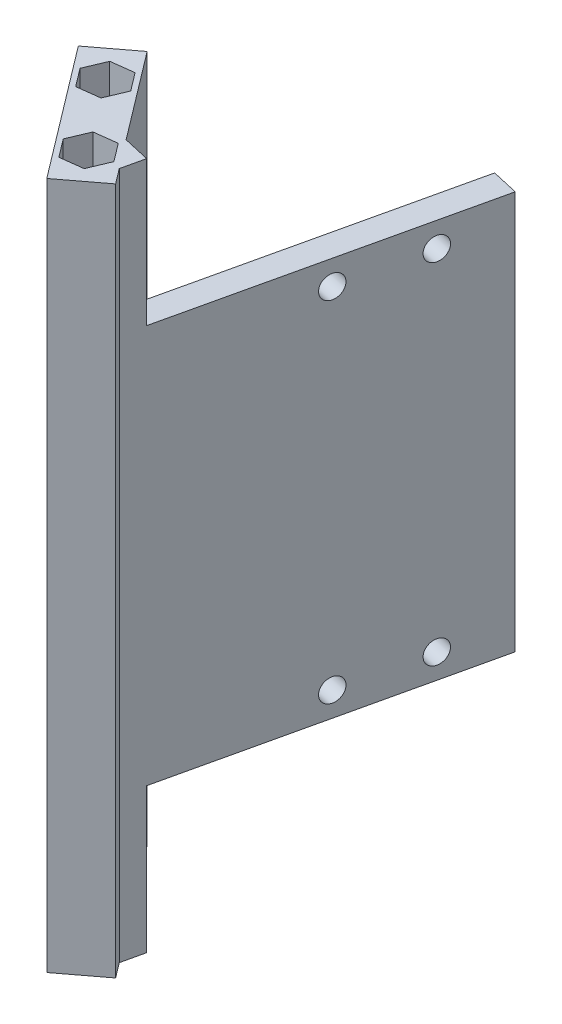
ISO-10303-21;
HEADER;
FILE_DESCRIPTION(('STEP AP214'),'2;1');
FILE_NAME('part.step','',(''),(''),'','','');
FILE_SCHEMA(('AUTOMOTIVE_DESIGN { 1 0 10303 214 1 1 1 1 }'));
ENDSEC;
DATA;
#1=APPLICATION_CONTEXT('core data for automotive mechanical design processes');
#2=APPLICATION_PROTOCOL_DEFINITION('international standard','automotive_design',2000,#1);
#3=PRODUCT_CONTEXT('',#1,'mechanical');
#4=PRODUCT('Part','Part','',(#3));
#5=PRODUCT_RELATED_PRODUCT_CATEGORY('part','',(#4));
#6=PRODUCT_DEFINITION_FORMATION('','',#4);
#7=PRODUCT_DEFINITION_CONTEXT('part definition',#1,'design');
#8=PRODUCT_DEFINITION('design','',#6,#7);
#9=PRODUCT_DEFINITION_SHAPE('','',#8);
#10=(LENGTH_UNIT() NAMED_UNIT(*) SI_UNIT(.MILLI.,.METRE.));
#11=(NAMED_UNIT(*) PLANE_ANGLE_UNIT() SI_UNIT($,.RADIAN.));
#12=(NAMED_UNIT(*) SI_UNIT($,.STERADIAN.) SOLID_ANGLE_UNIT());
#13=UNCERTAINTY_MEASURE_WITH_UNIT(LENGTH_MEASURE(1.E-05),#10,'distance_accuracy_value','');
#14=(GEOMETRIC_REPRESENTATION_CONTEXT(3) GLOBAL_UNCERTAINTY_ASSIGNED_CONTEXT((#13)) GLOBAL_UNIT_ASSIGNED_CONTEXT((#10,
#11,#12)) REPRESENTATION_CONTEXT('',''));
#15=CARTESIAN_POINT('',(0.,0.,0.));
#16=DIRECTION('',(0.,0.,1.));
#17=DIRECTION('',(1.,0.,0.));
#18=AXIS2_PLACEMENT_3D('',#15,#16,#17);
#19=CARTESIAN_POINT('',(67.5223445009082,126.,-128.357760025199));
#20=DIRECTION('',(-0.796824870464185,0.,0.604210332425501));
#21=DIRECTION('',(0.604210332425501,0.,0.796824870464185));
#22=AXIS2_PLACEMENT_3D('',#19,#20,#21);
#23=PLANE('',#22);
#24=DIRECTION('',(-0.604210332425502,0.,-0.796824870464185));
#25=VECTOR('',#24,1.);
#26=CARTESIAN_POINT('',(67.5223445009082,0.,-128.357760025199));
#27=LINE('',#26,#25);
#28=CARTESIAN_POINT('',(67.5223445009082,0.,-128.357760025199));
#29=VERTEX_POINT('',#28);
#30=CARTESIAN_POINT('',(65.4239440378438,0.,-131.125103758715));
#31=VERTEX_POINT('',#30);
#32=EDGE_CURVE('E336',#29,#31,#27,.T.);
#33=ORIENTED_EDGE('',*,*,#32,.T.);
#34=DIRECTION('',(0.,-1.,0.));
#35=VECTOR('',#34,1.);
#36=CARTESIAN_POINT('',(65.4239440378438,126.,-131.125103758715));
#37=LINE('',#36,#35);
#38=CARTESIAN_POINT('',(65.4239440378438,126.,-131.125103758715));
#39=VERTEX_POINT('',#38);
#40=EDGE_CURVE('E253',#39,#31,#37,.T.);
#41=ORIENTED_EDGE('',*,*,#40,.F.);
#42=DIRECTION('',(-0.604210332425502,0.,-0.796824870464185));
#43=VECTOR('',#42,1.);
#44=CARTESIAN_POINT('',(67.5223445009082,126.,-128.357760025199));
#45=LINE('',#44,#43);
#46=CARTESIAN_POINT('',(67.5223445009082,126.,-128.357760025199));
#47=VERTEX_POINT('',#46);
#48=EDGE_CURVE('E326',#47,#39,#45,.T.);
#49=ORIENTED_EDGE('',*,*,#48,.F.);
#50=DIRECTION('',(0.,-1.,0.));
#51=VECTOR('',#50,1.);
#52=CARTESIAN_POINT('',(67.5223445009082,126.,-128.357760025199));
#53=LINE('',#52,#51);
#54=EDGE_CURVE('E335',#47,#29,#53,.T.);
#55=ORIENTED_EDGE('',*,*,#54,.T.);
#56=EDGE_LOOP('',(#33,#41,#49,#55));
#57=FACE_BOUND('',#56,.T.);
#58=ADVANCED_FACE('F43',(#57),#23,.F.);
#59=CARTESIAN_POINT('',(0.,126.,0.));
#60=DIRECTION('',(0.,1.,0.));
#61=DIRECTION('',(0.,0.,1.));
#62=AXIS2_PLACEMENT_3D('',#59,#60,#61);
#63=PLANE('',#62);
#64=DIRECTION('',(-0.97504112145409,0.,-0.222024348830373));
#65=VECTOR('',#64,1.);
#66=CARTESIAN_POINT('',(71.2306523911913,126.,-134.105765241538));
#67=LINE('',#66,#65);
#68=CARTESIAN_POINT('',(66.3554467839236,126.,-135.215886985689));
#69=VERTEX_POINT('',#68);
#70=CARTESIAN_POINT('',(61.4802411766504,126.,-136.326008729842));
#71=VERTEX_POINT('',#70);
#72=EDGE_CURVE('E207',#69,#71,#67,.T.);
#73=ORIENTED_EDGE('',*,*,#72,.T.);
#74=CARTESIAN_POINT('',(49.3960345281431,126.,-152.262506139125));
#75=VERTEX_POINT('',#74);
#76=EDGE_CURVE('E228',#71,#75,#45,.T.);
#77=ORIENTED_EDGE('',*,*,#76,.T.);
#78=DIRECTION('',(-0.796824870464183,0.,0.604210332425504));
#79=VECTOR('',#78,1.);
#80=CARTESIAN_POINT('',(49.3960345281431,126.,-152.262506139125));
#81=LINE('',#80,#79);
#82=CARTESIAN_POINT('',(42.2246106939655,126.,-146.824613147295));
#83=VERTEX_POINT('',#82);
#84=EDGE_CURVE('E329',#75,#83,#81,.T.);
#85=ORIENTED_EDGE('',*,*,#84,.T.);
#86=DIRECTION('',(0.604210332425502,0.,0.796824870464184));
#87=VECTOR('',#86,1.);
#88=CARTESIAN_POINT('',(42.2246106939655,126.,-146.824613147295));
#89=LINE('',#88,#87);
#90=CARTESIAN_POINT('',(60.3509206667306,126.,-122.91986703337));
#91=VERTEX_POINT('',#90);
#92=EDGE_CURVE('E331',#83,#91,#89,.T.);
#93=ORIENTED_EDGE('',*,*,#92,.T.);
#94=DIRECTION('',(0.796824870464176,0.,-0.604210332425513));
#95=VECTOR('',#94,1.);
#96=CARTESIAN_POINT('',(60.3509206667306,126.,-122.91986703337));
#97=LINE('',#96,#95);
#98=EDGE_CURVE('E333',#91,#47,#97,.T.);
#99=ORIENTED_EDGE('',*,*,#98,.T.);
#100=ORIENTED_EDGE('',*,*,#48,.T.);
#101=DIRECTION('',(-0.222024348830392,0.,0.975041121454085));
#102=VECTOR('',#101,1.);
#103=CARTESIAN_POINT('',(78.8793690236961,126.,-190.215886985689));
#104=LINE('',#103,#102);
#105=EDGE_CURVE('E66',#69,#39,#104,.T.);
#106=ORIENTED_EDGE('',*,*,#105,.F.);
#107=EDGE_LOOP('',(#73,#77,#85,#93,#99,#100,#106));
#108=FACE_BOUND('',#107,.T.);
#109=DIRECTION('',(-0.992175746401979,0.,0.124849061877433));
#110=VECTOR('',#109,1.);
#111=CARTESIAN_POINT('',(51.6525368786409,126.,-147.797112139147));
#112=LINE('',#111,#110);
#113=CARTESIAN_POINT('',(51.6525368786409,126.,-147.797112139147));
#114=VERTEX_POINT('',#113);
#115=CARTESIAN_POINT('',(47.5281397519071,126.,-147.278124334869));
#116=VERTEX_POINT('',#115);
#117=EDGE_CURVE('E283',#114,#116,#112,.T.);
#118=ORIENTED_EDGE('',*,*,#117,.F.);
#119=DIRECTION('',(-0.604210332425503,0.,-0.796824870464183));
#120=VECTOR('',#119,1.);
#121=CARTESIAN_POINT('',(54.1641920647666,126.,-144.484773354238));
#122=LINE('',#121,#120);
#123=CARTESIAN_POINT('',(54.1641920647666,126.,-144.484773354238));
#124=VERTEX_POINT('',#123);
#125=EDGE_CURVE('E281',#124,#114,#122,.T.);
#126=ORIENTED_EDGE('',*,*,#125,.F.);
#127=DIRECTION('',(0.387965413976477,0.,-0.921673932341618));
#128=VECTOR('',#127,1.);
#129=CARTESIAN_POINT('',(52.5514501241585,126.,-140.653446765052));
#130=LINE('',#129,#128);
#131=CARTESIAN_POINT('',(52.5514501241585,126.,-140.653446765052));
#132=VERTEX_POINT('',#131);
#133=EDGE_CURVE('E293',#132,#124,#130,.T.);
#134=ORIENTED_EDGE('',*,*,#133,.F.);
#135=DIRECTION('',(0.992175746401977,0.,-0.124849061877452));
#136=VECTOR('',#135,1.);
#137=CARTESIAN_POINT('',(48.4270529974246,126.,-140.134458960775));
#138=LINE('',#137,#136);
#139=CARTESIAN_POINT('',(48.4270529974246,126.,-140.134458960775));
#140=VERTEX_POINT('',#139);
#141=EDGE_CURVE('E290',#140,#132,#138,.T.);
#142=ORIENTED_EDGE('',*,*,#141,.F.);
#143=DIRECTION('',(0.6042103324255,0.,0.796824870464186));
#144=VECTOR('',#143,1.);
#145=CARTESIAN_POINT('',(45.9153978112989,126.,-143.446797745683));
#146=LINE('',#145,#144);
#147=CARTESIAN_POINT('',(45.9153978112989,126.,-143.446797745683));
#148=VERTEX_POINT('',#147);
#149=EDGE_CURVE('E288',#148,#140,#146,.T.);
#150=ORIENTED_EDGE('',*,*,#149,.F.);
#151=DIRECTION('',(-0.387965413976479,0.,0.921673932341617));
#152=VECTOR('',#151,1.);
#153=CARTESIAN_POINT('',(47.5281397519071,126.,-147.278124334869));
#154=LINE('',#153,#152);
#155=EDGE_CURVE('E286',#116,#148,#154,.T.);
#156=ORIENTED_EDGE('',*,*,#155,.F.);
#157=EDGE_LOOP('',(#118,#126,#134,#142,#150,#156));
#158=FACE_BOUND('',#157,.T.);
#159=DIRECTION('',(-0.992175746401984,0.,0.124849061877393));
#160=VECTOR('',#159,1.);
#161=CARTESIAN_POINT('',(61.3199021974491,126.,-135.04791421172));
#162=LINE('',#161,#160);
#163=CARTESIAN_POINT('',(61.3199021974491,126.,-135.04791421172));
#164=VERTEX_POINT('',#163);
#165=CARTESIAN_POINT('',(57.1955050707153,126.,-134.528926407442));
#166=VERTEX_POINT('',#165);
#167=EDGE_CURVE('E236',#164,#166,#162,.T.);
#168=ORIENTED_EDGE('',*,*,#167,.F.);
#169=DIRECTION('',(-0.604210332425468,0.,-0.79682487046421));
#170=VECTOR('',#169,1.);
#171=CARTESIAN_POINT('',(63.8315573835746,126.,-131.735575426811));
#172=LINE('',#171,#170);
#173=CARTESIAN_POINT('',(63.8315573835746,126.,-131.735575426811));
#174=VERTEX_POINT('',#173);
#175=EDGE_CURVE('E234',#174,#164,#172,.T.);
#176=ORIENTED_EDGE('',*,*,#175,.F.);
#177=DIRECTION('',(0.387965413976512,0.,-0.921673932341603));
#178=VECTOR('',#177,1.);
#179=CARTESIAN_POINT('',(62.2188154429663,126.,-127.904248837625));
#180=LINE('',#179,#178);
#181=CARTESIAN_POINT('',(62.2188154429663,126.,-127.904248837625));
#182=VERTEX_POINT('',#181);
#183=EDGE_CURVE('E246',#182,#174,#180,.T.);
#184=ORIENTED_EDGE('',*,*,#183,.F.);
#185=DIRECTION('',(0.992175746401984,0.,-0.124849061877394));
#186=VECTOR('',#185,1.);
#187=CARTESIAN_POINT('',(58.0944183162325,126.,-127.385261033348));
#188=LINE('',#187,#186);
#189=CARTESIAN_POINT('',(58.0944183162325,126.,-127.385261033348));
#190=VERTEX_POINT('',#189);
#191=EDGE_CURVE('E243',#190,#182,#188,.T.);
#192=ORIENTED_EDGE('',*,*,#191,.F.);
#193=DIRECTION('',(0.60421033242547,0.,0.796824870464208));
#194=VECTOR('',#193,1.);
#195=CARTESIAN_POINT('',(55.582763130107,126.,-130.697599818256));
#196=LINE('',#195,#194);
#197=CARTESIAN_POINT('',(55.582763130107,126.,-130.697599818256));
#198=VERTEX_POINT('',#197);
#199=EDGE_CURVE('E241',#198,#190,#196,.T.);
#200=ORIENTED_EDGE('',*,*,#199,.F.);
#201=DIRECTION('',(-0.387965413976513,0.,0.921673932341603));
#202=VECTOR('',#201,1.);
#203=CARTESIAN_POINT('',(57.1955050707153,126.,-134.528926407442));
#204=LINE('',#203,#202);
#205=EDGE_CURVE('E239',#166,#198,#204,.T.);
#206=ORIENTED_EDGE('',*,*,#205,.F.);
#207=EDGE_LOOP('',(#168,#176,#184,#192,#200,#206));
#208=FACE_BOUND('',#207,.T.);
#209=ADVANCED_FACE('F372',(#108,#158,#208),#63,.T.);
#210=CARTESIAN_POINT('',(0.,0.,0.));
#211=DIRECTION('',(0.,1.,0.));
#212=DIRECTION('',(0.,0.,1.));
#213=AXIS2_PLACEMENT_3D('',#210,#211,#212);
#214=PLANE('',#213);
#215=DIRECTION('',(-0.604210332425503,0.,-0.796824870464183));
#216=VECTOR('',#215,1.);
#217=CARTESIAN_POINT('',(54.1641920647666,0.,-144.484773354238));
#218=LINE('',#217,#216);
#219=CARTESIAN_POINT('',(54.1641920647666,0.,-144.484773354238));
#220=VERTEX_POINT('',#219);
#221=CARTESIAN_POINT('',(51.6525368786409,0.,-147.797112139147));
#222=VERTEX_POINT('',#221);
#223=EDGE_CURVE('E280',#220,#222,#218,.T.);
#224=ORIENTED_EDGE('',*,*,#223,.T.);
#225=DIRECTION('',(-0.992175746401979,0.,0.124849061877433));
#226=VECTOR('',#225,1.);
#227=CARTESIAN_POINT('',(51.6525368786409,0.,-147.797112139147));
#228=LINE('',#227,#226);
#229=CARTESIAN_POINT('',(47.5281397519071,0.,-147.278124334869));
#230=VERTEX_POINT('',#229);
#231=EDGE_CURVE('E298',#222,#230,#228,.T.);
#232=ORIENTED_EDGE('',*,*,#231,.T.);
#233=DIRECTION('',(-0.387965413976479,0.,0.921673932341617));
#234=VECTOR('',#233,1.);
#235=CARTESIAN_POINT('',(47.5281397519071,0.,-147.278124334869));
#236=LINE('',#235,#234);
#237=CARTESIAN_POINT('',(45.9153978112989,0.,-143.446797745683));
#238=VERTEX_POINT('',#237);
#239=EDGE_CURVE('E301',#230,#238,#236,.T.);
#240=ORIENTED_EDGE('',*,*,#239,.T.);
#241=DIRECTION('',(0.6042103324255,0.,0.796824870464186));
#242=VECTOR('',#241,1.);
#243=CARTESIAN_POINT('',(45.9153978112989,0.,-143.446797745683));
#244=LINE('',#243,#242);
#245=CARTESIAN_POINT('',(48.4270529974246,0.,-140.134458960775));
#246=VERTEX_POINT('',#245);
#247=EDGE_CURVE('E304',#238,#246,#244,.T.);
#248=ORIENTED_EDGE('',*,*,#247,.T.);
#249=DIRECTION('',(0.992175746401977,0.,-0.124849061877452));
#250=VECTOR('',#249,1.);
#251=CARTESIAN_POINT('',(48.4270529974246,0.,-140.134458960775));
#252=LINE('',#251,#250);
#253=CARTESIAN_POINT('',(52.5514501241585,0.,-140.653446765052));
#254=VERTEX_POINT('',#253);
#255=EDGE_CURVE('E307',#246,#254,#252,.T.);
#256=ORIENTED_EDGE('',*,*,#255,.T.);
#257=DIRECTION('',(0.387965413976477,0.,-0.921673932341618));
#258=VECTOR('',#257,1.);
#259=CARTESIAN_POINT('',(52.5514501241585,0.,-140.653446765052));
#260=LINE('',#259,#258);
#261=EDGE_CURVE('E284',#254,#220,#260,.T.);
#262=ORIENTED_EDGE('',*,*,#261,.T.);
#263=EDGE_LOOP('',(#224,#232,#240,#248,#256,#262));
#264=FACE_BOUND('',#263,.T.);
#265=CARTESIAN_POINT('',(61.4802411766532,0.,-136.326008729841));
#266=VERTEX_POINT('',#265);
#267=CARTESIAN_POINT('',(49.3960345281431,0.,-152.262506139125));
#268=VERTEX_POINT('',#267);
#269=EDGE_CURVE('E325',#266,#268,#27,.T.);
#270=ORIENTED_EDGE('',*,*,#269,.F.);
#271=DIRECTION('',(-0.97504112145409,0.,-0.222024348830373));
#272=VECTOR('',#271,1.);
#273=CARTESIAN_POINT('',(71.2306523911913,0.,-134.105765241538));
#274=LINE('',#273,#272);
#275=CARTESIAN_POINT('',(66.3554467839236,0.,-135.215886985689));
#276=VERTEX_POINT('',#275);
#277=EDGE_CURVE('E377',#276,#266,#274,.T.);
#278=ORIENTED_EDGE('',*,*,#277,.F.);
#279=DIRECTION('',(-0.222024348830392,0.,0.975041121454085));
#280=VECTOR('',#279,1.);
#281=CARTESIAN_POINT('',(78.8793690236961,0.,-190.215886985689));
#282=LINE('',#281,#280);
#283=EDGE_CURVE('E379',#276,#31,#282,.T.);
#284=ORIENTED_EDGE('',*,*,#283,.T.);
#285=ORIENTED_EDGE('',*,*,#32,.F.);
#286=DIRECTION('',(0.796824870464176,0.,-0.604210332425513));
#287=VECTOR('',#286,1.);
#288=CARTESIAN_POINT('',(60.3509206667306,0.,-122.91986703337));
#289=LINE('',#288,#287);
#290=CARTESIAN_POINT('',(60.3509206667306,0.,-122.91986703337));
#291=VERTEX_POINT('',#290);
#292=EDGE_CURVE('E343',#291,#29,#289,.T.);
#293=ORIENTED_EDGE('',*,*,#292,.F.);
#294=DIRECTION('',(0.604210332425502,0.,0.796824870464184));
#295=VECTOR('',#294,1.);
#296=CARTESIAN_POINT('',(42.2246106939655,0.,-146.824613147295));
#297=LINE('',#296,#295);
#298=CARTESIAN_POINT('',(42.2246106939655,0.,-146.824613147295));
#299=VERTEX_POINT('',#298);
#300=EDGE_CURVE('E341',#299,#291,#297,.T.);
#301=ORIENTED_EDGE('',*,*,#300,.F.);
#302=DIRECTION('',(-0.796824870464183,0.,0.604210332425504));
#303=VECTOR('',#302,1.);
#304=CARTESIAN_POINT('',(49.3960345281431,0.,-152.262506139125));
#305=LINE('',#304,#303);
#306=EDGE_CURVE('E339',#268,#299,#305,.T.);
#307=ORIENTED_EDGE('',*,*,#306,.F.);
#308=EDGE_LOOP('',(#270,#278,#284,#285,#293,#301,#307));
#309=FACE_BOUND('',#308,.T.);
#310=DIRECTION('',(-0.604210332425468,0.,-0.79682487046421));
#311=VECTOR('',#310,1.);
#312=CARTESIAN_POINT('',(63.8315573835746,0.,-131.735575426811));
#313=LINE('',#312,#311);
#314=CARTESIAN_POINT('',(63.8315573835746,0.,-131.735575426811));
#315=VERTEX_POINT('',#314);
#316=CARTESIAN_POINT('',(61.3199021974491,0.,-135.04791421172));
#317=VERTEX_POINT('',#316);
#318=EDGE_CURVE('E249',#315,#317,#313,.T.);
#319=ORIENTED_EDGE('',*,*,#318,.T.);
#320=DIRECTION('',(-0.992175746401984,0.,0.124849061877393));
#321=VECTOR('',#320,1.);
#322=CARTESIAN_POINT('',(61.3199021974491,0.,-135.04791421172));
#323=LINE('',#322,#321);
#324=CARTESIAN_POINT('',(57.1955050707153,0.,-134.528926407442));
#325=VERTEX_POINT('',#324);
#326=EDGE_CURVE('E252',#317,#325,#323,.T.);
#327=ORIENTED_EDGE('',*,*,#326,.T.);
#328=DIRECTION('',(-0.387965413976513,0.,0.921673932341603));
#329=VECTOR('',#328,1.);
#330=CARTESIAN_POINT('',(57.1955050707153,0.,-134.528926407442));
#331=LINE('',#330,#329);
#332=CARTESIAN_POINT('',(55.582763130107,0.,-130.697599818256));
#333=VERTEX_POINT('',#332);
#334=EDGE_CURVE('E256',#325,#333,#331,.T.);
#335=ORIENTED_EDGE('',*,*,#334,.T.);
#336=DIRECTION('',(0.60421033242547,0.,0.796824870464208));
#337=VECTOR('',#336,1.);
#338=CARTESIAN_POINT('',(55.582763130107,0.,-130.697599818256));
#339=LINE('',#338,#337);
#340=CARTESIAN_POINT('',(58.0944183162325,0.,-127.385261033348));
#341=VERTEX_POINT('',#340);
#342=EDGE_CURVE('E259',#333,#341,#339,.T.);
#343=ORIENTED_EDGE('',*,*,#342,.T.);
#344=DIRECTION('',(0.992175746401984,0.,-0.124849061877394));
#345=VECTOR('',#344,1.);
#346=CARTESIAN_POINT('',(58.0944183162325,0.,-127.385261033348));
#347=LINE('',#346,#345);
#348=CARTESIAN_POINT('',(62.2188154429663,0.,-127.904248837625));
#349=VERTEX_POINT('',#348);
#350=EDGE_CURVE('E262',#341,#349,#347,.T.);
#351=ORIENTED_EDGE('',*,*,#350,.T.);
#352=DIRECTION('',(0.387965413976512,0.,-0.921673932341603));
#353=VECTOR('',#352,1.);
#354=CARTESIAN_POINT('',(62.2188154429663,0.,-127.904248837625));
#355=LINE('',#354,#353);
#356=EDGE_CURVE('E237',#349,#315,#355,.T.);
#357=ORIENTED_EDGE('',*,*,#356,.T.);
#358=EDGE_LOOP('',(#319,#327,#335,#343,#351,#357));
#359=FACE_BOUND('',#358,.T.);
#360=ADVANCED_FACE('F362',(#264,#309,#359),#214,.F.);
#361=ORIENTED_EDGE('',*,*,#76,.F.);
#362=DIRECTION('',(0.,-1.,0.));
#363=VECTOR('',#362,1.);
#364=CARTESIAN_POINT('',(61.4802411766532,126.,-136.326008729841));
#365=LINE('',#364,#363);
#366=CARTESIAN_POINT('',(61.4802411766504,99.5,-136.326008729842));
#367=VERTEX_POINT('',#366);
#368=EDGE_CURVE('E203',#71,#367,#365,.T.);
#369=ORIENTED_EDGE('',*,*,#368,.T.);
#370=CARTESIAN_POINT('',(61.4802411766504,26.5,-136.326008729842));
#371=VERTEX_POINT('',#370);
#372=EDGE_CURVE('E219',#367,#371,#365,.T.);
#373=ORIENTED_EDGE('',*,*,#372,.T.);
#374=DIRECTION('',(0.,1.,0.));
#375=VECTOR('',#374,1.);
#376=CARTESIAN_POINT('',(61.4802411766504,0.,-136.326008729842));
#377=LINE('',#376,#375);
#378=EDGE_CURVE('E215',#266,#371,#377,.T.);
#379=ORIENTED_EDGE('',*,*,#378,.F.);
#380=ORIENTED_EDGE('',*,*,#269,.T.);
#381=DIRECTION('',(0.,-1.,0.));
#382=VECTOR('',#381,1.);
#383=CARTESIAN_POINT('',(49.3960345281431,126.,-152.262506139125));
#384=LINE('',#383,#382);
#385=EDGE_CURVE('E11',#75,#268,#384,.T.);
#386=ORIENTED_EDGE('',*,*,#385,.F.);
#387=EDGE_LOOP('',(#361,#369,#373,#379,#380,#386));
#388=FACE_BOUND('',#387,.T.);
#389=ADVANCED_FACE('F45',(#388),#23,.F.);
#390=CARTESIAN_POINT('',(49.3960345281431,126.,-152.262506139125));
#391=DIRECTION('',(0.604210332425504,0.,0.796824870464183));
#392=DIRECTION('',(0.796824870464183,0.,-0.604210332425504));
#393=AXIS2_PLACEMENT_3D('',#390,#391,#392);
#394=PLANE('',#393);
#395=ORIENTED_EDGE('',*,*,#306,.T.);
#396=DIRECTION('',(0.,-1.,0.));
#397=VECTOR('',#396,1.);
#398=CARTESIAN_POINT('',(42.2246106939655,126.,-146.824613147295));
#399=LINE('',#398,#397);
#400=EDGE_CURVE('E51',#83,#299,#399,.T.);
#401=ORIENTED_EDGE('',*,*,#400,.F.);
#402=ORIENTED_EDGE('',*,*,#84,.F.);
#403=ORIENTED_EDGE('',*,*,#385,.T.);
#404=EDGE_LOOP('',(#395,#401,#402,#403));
#405=FACE_BOUND('',#404,.T.);
#406=ADVANCED_FACE('F374',(#405),#394,.F.);
#407=CARTESIAN_POINT('',(42.2246106939655,126.,-146.824613147295));
#408=DIRECTION('',(0.796824870464184,0.,-0.604210332425502));
#409=DIRECTION('',(-0.604210332425502,0.,-0.796824870464184));
#410=AXIS2_PLACEMENT_3D('',#407,#408,#409);
#411=PLANE('',#410);
#412=ORIENTED_EDGE('',*,*,#300,.T.);
#413=DIRECTION('',(0.,-1.,0.));
#414=VECTOR('',#413,1.);
#415=CARTESIAN_POINT('',(60.3509206667306,126.,-122.91986703337));
#416=LINE('',#415,#414);
#417=EDGE_CURVE('E347',#91,#291,#416,.T.);
#418=ORIENTED_EDGE('',*,*,#417,.F.);
#419=ORIENTED_EDGE('',*,*,#92,.F.);
#420=ORIENTED_EDGE('',*,*,#400,.T.);
#421=EDGE_LOOP('',(#412,#418,#419,#420));
#422=FACE_BOUND('',#421,.T.);
#423=ADVANCED_FACE('F354',(#422),#411,.F.);
#424=CARTESIAN_POINT('',(60.3509206667306,126.,-122.91986703337));
#425=DIRECTION('',(-0.604210332425513,0.,-0.796824870464176));
#426=DIRECTION('',(-0.796824870464176,0.,0.604210332425513));
#427=AXIS2_PLACEMENT_3D('',#424,#425,#426);
#428=PLANE('',#427);
#429=ORIENTED_EDGE('',*,*,#292,.T.);
#430=ORIENTED_EDGE('',*,*,#54,.F.);
#431=ORIENTED_EDGE('',*,*,#98,.F.);
#432=ORIENTED_EDGE('',*,*,#417,.T.);
#433=EDGE_LOOP('',(#429,#430,#431,#432));
#434=FACE_BOUND('',#433,.T.);
#435=ADVANCED_FACE('F367',(#434),#428,.F.);
#436=CARTESIAN_POINT('',(54.1641920647666,126.,-144.484773354238));
#437=DIRECTION('',(-0.796824870464184,0.,0.604210332425503));
#438=DIRECTION('',(0.604210332425503,0.,0.796824870464184));
#439=AXIS2_PLACEMENT_3D('',#436,#437,#438);
#440=PLANE('',#439);
#441=ORIENTED_EDGE('',*,*,#223,.F.);
#442=DIRECTION('',(0.,-1.,0.));
#443=VECTOR('',#442,1.);
#444=CARTESIAN_POINT('',(54.1641920647666,126.,-144.484773354238));
#445=LINE('',#444,#443);
#446=EDGE_CURVE('E295',#124,#220,#445,.T.);
#447=ORIENTED_EDGE('',*,*,#446,.F.);
#448=ORIENTED_EDGE('',*,*,#125,.T.);
#449=DIRECTION('',(0.,-1.,0.));
#450=VECTOR('',#449,1.);
#451=CARTESIAN_POINT('',(51.6525368786409,126.,-147.797112139147));
#452=LINE('',#451,#450);
#453=EDGE_CURVE('E322',#114,#222,#452,.T.);
#454=ORIENTED_EDGE('',*,*,#453,.T.);
#455=EDGE_LOOP('',(#441,#447,#448,#454));
#456=FACE_BOUND('',#455,.T.);
#457=ADVANCED_FACE('F476',(#456),#440,.T.);
#458=CARTESIAN_POINT('',(51.6525368786409,126.,-147.797112139147));
#459=DIRECTION('',(0.124849061877433,0.,0.992175746401979));
#460=DIRECTION('',(0.99217574640198,0.,-0.124849061877433));
#461=AXIS2_PLACEMENT_3D('',#458,#459,#460);
#462=PLANE('',#461);
#463=ORIENTED_EDGE('',*,*,#231,.F.);
#464=ORIENTED_EDGE('',*,*,#453,.F.);
#465=ORIENTED_EDGE('',*,*,#117,.T.);
#466=DIRECTION('',(0.,-1.,0.));
#467=VECTOR('',#466,1.);
#468=CARTESIAN_POINT('',(47.5281397519071,126.,-147.278124334869));
#469=LINE('',#468,#467);
#470=EDGE_CURVE('E320',#116,#230,#469,.T.);
#471=ORIENTED_EDGE('',*,*,#470,.T.);
#472=EDGE_LOOP('',(#463,#464,#465,#471));
#473=FACE_BOUND('',#472,.T.);
#474=ADVANCED_FACE('F494',(#473),#462,.T.);
#475=CARTESIAN_POINT('',(47.5281397519071,126.,-147.278124334869));
#476=DIRECTION('',(0.921673932341617,0.,0.387965413976479));
#477=DIRECTION('',(0.387965413976479,0.,-0.921673932341617));
#478=AXIS2_PLACEMENT_3D('',#475,#476,#477);
#479=PLANE('',#478);
#480=ORIENTED_EDGE('',*,*,#239,.F.);
#481=ORIENTED_EDGE('',*,*,#470,.F.);
#482=ORIENTED_EDGE('',*,*,#155,.T.);
#483=DIRECTION('',(0.,-1.,0.));
#484=VECTOR('',#483,1.);
#485=CARTESIAN_POINT('',(45.9153978112989,126.,-143.446797745683));
#486=LINE('',#485,#484);
#487=EDGE_CURVE('E318',#148,#238,#486,.T.);
#488=ORIENTED_EDGE('',*,*,#487,.T.);
#489=EDGE_LOOP('',(#480,#481,#482,#488));
#490=FACE_BOUND('',#489,.T.);
#491=ADVANCED_FACE('F502',(#490),#479,.T.);
#492=CARTESIAN_POINT('',(45.9153978112989,126.,-143.446797745683));
#493=DIRECTION('',(0.796824870464186,0.,-0.6042103324255));
#494=DIRECTION('',(-0.6042103324255,0.,-0.796824870464186));
#495=AXIS2_PLACEMENT_3D('',#492,#493,#494);
#496=PLANE('',#495);
#497=ORIENTED_EDGE('',*,*,#247,.F.);
#498=ORIENTED_EDGE('',*,*,#487,.F.);
#499=ORIENTED_EDGE('',*,*,#149,.T.);
#500=DIRECTION('',(0.,-1.,0.));
#501=VECTOR('',#500,1.);
#502=CARTESIAN_POINT('',(48.4270529974246,126.,-140.134458960775));
#503=LINE('',#502,#501);
#504=EDGE_CURVE('E316',#140,#246,#503,.T.);
#505=ORIENTED_EDGE('',*,*,#504,.T.);
#506=EDGE_LOOP('',(#497,#498,#499,#505));
#507=FACE_BOUND('',#506,.T.);
#508=ADVANCED_FACE('F511',(#507),#496,.T.);
#509=CARTESIAN_POINT('',(48.4270529974246,126.,-140.134458960775));
#510=DIRECTION('',(-0.124849061877452,0.,-0.992175746401977));
#511=DIRECTION('',(-0.992175746401977,0.,0.124849061877452));
#512=AXIS2_PLACEMENT_3D('',#509,#510,#511);
#513=PLANE('',#512);
#514=ORIENTED_EDGE('',*,*,#255,.F.);
#515=ORIENTED_EDGE('',*,*,#504,.F.);
#516=ORIENTED_EDGE('',*,*,#141,.T.);
#517=DIRECTION('',(0.,-1.,0.));
#518=VECTOR('',#517,1.);
#519=CARTESIAN_POINT('',(52.5514501241585,126.,-140.653446765052));
#520=LINE('',#519,#518);
#521=EDGE_CURVE('E314',#132,#254,#520,.T.);
#522=ORIENTED_EDGE('',*,*,#521,.T.);
#523=EDGE_LOOP('',(#514,#515,#516,#522));
#524=FACE_BOUND('',#523,.T.);
#525=ADVANCED_FACE('F520',(#524),#513,.T.);
#526=CARTESIAN_POINT('',(52.5514501241585,126.,-140.653446765052));
#527=DIRECTION('',(-0.921673932341618,0.,-0.387965413976477));
#528=DIRECTION('',(-0.387965413976477,0.,0.921673932341618));
#529=AXIS2_PLACEMENT_3D('',#526,#527,#528);
#530=PLANE('',#529);
#531=ORIENTED_EDGE('',*,*,#261,.F.);
#532=ORIENTED_EDGE('',*,*,#521,.F.);
#533=ORIENTED_EDGE('',*,*,#133,.T.);
#534=ORIENTED_EDGE('',*,*,#446,.T.);
#535=EDGE_LOOP('',(#531,#532,#533,#534));
#536=FACE_BOUND('',#535,.T.);
#537=ADVANCED_FACE('F529',(#536),#530,.T.);
#538=CARTESIAN_POINT('',(63.8315573835746,126.,-131.735575426811));
#539=DIRECTION('',(-0.79682487046421,0.,0.604210332425468));
#540=DIRECTION('',(0.604210332425468,0.,0.79682487046421));
#541=AXIS2_PLACEMENT_3D('',#538,#539,#540);
#542=PLANE('',#541);
#543=ORIENTED_EDGE('',*,*,#318,.F.);
#544=DIRECTION('',(0.,-1.,0.));
#545=VECTOR('',#544,1.);
#546=CARTESIAN_POINT('',(63.8315573835746,126.,-131.735575426811));
#547=LINE('',#546,#545);
#548=EDGE_CURVE('E248',#174,#315,#547,.T.);
#549=ORIENTED_EDGE('',*,*,#548,.F.);
#550=ORIENTED_EDGE('',*,*,#175,.T.);
#551=DIRECTION('',(0.,-1.,0.));
#552=VECTOR('',#551,1.);
#553=CARTESIAN_POINT('',(61.3199021974491,126.,-135.04791421172));
#554=LINE('',#553,#552);
#555=EDGE_CURVE('E277',#164,#317,#554,.T.);
#556=ORIENTED_EDGE('',*,*,#555,.T.);
#557=EDGE_LOOP('',(#543,#549,#550,#556));
#558=FACE_BOUND('',#557,.T.);
#559=ADVANCED_FACE('F538',(#558),#542,.T.);
#560=CARTESIAN_POINT('',(61.3199021974491,126.,-135.04791421172));
#561=DIRECTION('',(0.124849061877393,0.,0.992175746401984));
#562=DIRECTION('',(0.992175746401984,0.,-0.124849061877393));
#563=AXIS2_PLACEMENT_3D('',#560,#561,#562);
#564=PLANE('',#563);
#565=ORIENTED_EDGE('',*,*,#326,.F.);
#566=ORIENTED_EDGE('',*,*,#555,.F.);
#567=ORIENTED_EDGE('',*,*,#167,.T.);
#568=DIRECTION('',(0.,-1.,0.));
#569=VECTOR('',#568,1.);
#570=CARTESIAN_POINT('',(57.1955050707153,126.,-134.528926407442));
#571=LINE('',#570,#569);
#572=EDGE_CURVE('E275',#166,#325,#571,.T.);
#573=ORIENTED_EDGE('',*,*,#572,.T.);
#574=EDGE_LOOP('',(#565,#566,#567,#573));
#575=FACE_BOUND('',#574,.T.);
#576=ADVANCED_FACE('F547',(#575),#564,.T.);
#577=CARTESIAN_POINT('',(57.1955050707153,126.,-134.528926407442));
#578=DIRECTION('',(0.921673932341602,0.,0.387965413976513));
#579=DIRECTION('',(0.387965413976513,0.,-0.921673932341602));
#580=AXIS2_PLACEMENT_3D('',#577,#578,#579);
#581=PLANE('',#580);
#582=ORIENTED_EDGE('',*,*,#334,.F.);
#583=ORIENTED_EDGE('',*,*,#572,.F.);
#584=ORIENTED_EDGE('',*,*,#205,.T.);
#585=DIRECTION('',(0.,-1.,0.));
#586=VECTOR('',#585,1.);
#587=CARTESIAN_POINT('',(55.582763130107,126.,-130.697599818256));
#588=LINE('',#587,#586);
#589=EDGE_CURVE('E273',#198,#333,#588,.T.);
#590=ORIENTED_EDGE('',*,*,#589,.T.);
#591=EDGE_LOOP('',(#582,#583,#584,#590));
#592=FACE_BOUND('',#591,.T.);
#593=ADVANCED_FACE('F556',(#592),#581,.T.);
#594=CARTESIAN_POINT('',(55.582763130107,126.,-130.697599818256));
#595=DIRECTION('',(0.796824870464208,0.,-0.60421033242547));
#596=DIRECTION('',(-0.60421033242547,0.,-0.796824870464209));
#597=AXIS2_PLACEMENT_3D('',#594,#595,#596);
#598=PLANE('',#597);
#599=ORIENTED_EDGE('',*,*,#342,.F.);
#600=ORIENTED_EDGE('',*,*,#589,.F.);
#601=ORIENTED_EDGE('',*,*,#199,.T.);
#602=DIRECTION('',(0.,-1.,0.));
#603=VECTOR('',#602,1.);
#604=CARTESIAN_POINT('',(58.0944183162325,126.,-127.385261033348));
#605=LINE('',#604,#603);
#606=EDGE_CURVE('E271',#190,#341,#605,.T.);
#607=ORIENTED_EDGE('',*,*,#606,.T.);
#608=EDGE_LOOP('',(#599,#600,#601,#607));
#609=FACE_BOUND('',#608,.T.);
#610=ADVANCED_FACE('F565',(#609),#598,.T.);
#611=CARTESIAN_POINT('',(58.0944183162325,126.,-127.385261033348));
#612=DIRECTION('',(-0.124849061877394,0.,-0.992175746401984));
#613=DIRECTION('',(-0.992175746401984,0.,0.124849061877394));
#614=AXIS2_PLACEMENT_3D('',#611,#612,#613);
#615=PLANE('',#614);
#616=ORIENTED_EDGE('',*,*,#350,.F.);
#617=ORIENTED_EDGE('',*,*,#606,.F.);
#618=ORIENTED_EDGE('',*,*,#191,.T.);
#619=DIRECTION('',(0.,-1.,0.));
#620=VECTOR('',#619,1.);
#621=CARTESIAN_POINT('',(62.2188154429663,126.,-127.904248837625));
#622=LINE('',#621,#620);
#623=EDGE_CURVE('E269',#182,#349,#622,.T.);
#624=ORIENTED_EDGE('',*,*,#623,.T.);
#625=EDGE_LOOP('',(#616,#617,#618,#624));
#626=FACE_BOUND('',#625,.T.);
#627=ADVANCED_FACE('F574',(#626),#615,.T.);
#628=CARTESIAN_POINT('',(62.2188154429663,126.,-127.904248837625));
#629=DIRECTION('',(-0.921673932341603,0.,-0.387965413976512));
#630=DIRECTION('',(-0.387965413976512,0.,0.921673932341603));
#631=AXIS2_PLACEMENT_3D('',#628,#629,#630);
#632=PLANE('',#631);
#633=ORIENTED_EDGE('',*,*,#356,.F.);
#634=ORIENTED_EDGE('',*,*,#623,.F.);
#635=ORIENTED_EDGE('',*,*,#183,.T.);
#636=ORIENTED_EDGE('',*,*,#548,.T.);
#637=EDGE_LOOP('',(#633,#634,#635,#636));
#638=FACE_BOUND('',#637,.T.);
#639=ADVANCED_FACE('F437',(#638),#632,.T.);
#640=CARTESIAN_POINT('',(78.8793690236961,126.,-190.215886985689));
#641=DIRECTION('',(0.975041121454085,0.,0.222024348830392));
#642=DIRECTION('',(0.222024348830392,0.,-0.975041121454085));
#643=AXIS2_PLACEMENT_3D('',#640,#641,#642);
#644=PLANE('',#643);
#645=DIRECTION('',(0.,-1.,0.));
#646=VECTOR('',#645,1.);
#647=CARTESIAN_POINT('',(66.3554467839236,126.,-135.215886985689));
#648=LINE('',#647,#646);
#649=CARTESIAN_POINT('',(66.3554467839236,99.5,-135.215886985689));
#650=VERTEX_POINT('',#649);
#651=EDGE_CURVE('E205',#69,#650,#648,.T.);
#652=ORIENTED_EDGE('',*,*,#651,.F.);
#653=ORIENTED_EDGE('',*,*,#105,.T.);
#654=ORIENTED_EDGE('',*,*,#40,.T.);
#655=ORIENTED_EDGE('',*,*,#283,.F.);
#656=DIRECTION('',(0.,-1.,0.));
#657=VECTOR('',#656,1.);
#658=CARTESIAN_POINT('',(66.3554467839236,126.,-135.215886985689));
#659=LINE('',#658,#657);
#660=CARTESIAN_POINT('',(66.3554467839236,26.5,-135.215886985689));
#661=VERTEX_POINT('',#660);
#662=EDGE_CURVE('E387',#661,#276,#659,.T.);
#663=ORIENTED_EDGE('',*,*,#662,.F.);
#664=DIRECTION('',(-0.222024348830392,0.,0.975041121454085));
#665=VECTOR('',#664,1.);
#666=CARTESIAN_POINT('',(78.8793690236961,26.5,-190.215886985689));
#667=LINE('',#666,#665);
#668=CARTESIAN_POINT('',(78.8793690236961,26.5,-190.215886985689));
#669=VERTEX_POINT('',#668);
#670=EDGE_CURVE('E402',#669,#661,#667,.T.);
#671=ORIENTED_EDGE('',*,*,#670,.F.);
#672=DIRECTION('',(0.,-1.,0.));
#673=VECTOR('',#672,1.);
#674=CARTESIAN_POINT('',(78.8793690236961,126.,-190.215886985689));
#675=LINE('',#674,#673);
#676=CARTESIAN_POINT('',(78.8793690236961,99.5,-190.215886985689));
#677=VERTEX_POINT('',#676);
#678=EDGE_CURVE('E230',#677,#669,#675,.T.);
#679=ORIENTED_EDGE('',*,*,#678,.F.);
#680=DIRECTION('',(0.222024348830392,0.,-0.975041121454085));
#681=VECTOR('',#680,1.);
#682=CARTESIAN_POINT('',(78.8793690236961,99.5,-190.215886985689));
#683=LINE('',#682,#681);
#684=EDGE_CURVE('E401',#650,#677,#683,.T.);
#685=ORIENTED_EDGE('',*,*,#684,.F.);
#686=EDGE_LOOP('',(#652,#653,#654,#655,#663,#671,#679,#685));
#687=FACE_BOUND('',#686,.T.);
#688=CARTESIAN_POINT('',(72.6626872564452,95.,-162.914735584975));
#689=DIRECTION('',(0.975041121454085,0.,0.222024348830392));
#690=DIRECTION('',(0.222024348830392,0.,-0.975041121454085));
#691=AXIS2_PLACEMENT_3D('',#688,#689,#690);
#692=CIRCLE('',#691,2.09999999999998);
#693=CARTESIAN_POINT('',(73.128938388989,95.,-164.962321940028));
#694=VERTEX_POINT('',#693);
#695=EDGE_CURVE('E388',#694,#694,#692,.T.);
#696=ORIENTED_EDGE('',*,*,#695,.F.);
#697=EDGE_LOOP('',(#696));
#698=FACE_BOUND('',#697,.T.);
#699=CARTESIAN_POINT('',(72.6626872564452,31.,-162.914735584975));
#700=DIRECTION('',(0.975041121454085,0.,0.222024348830392));
#701=DIRECTION('',(0.222024348830392,0.,-0.975041121454085));
#702=AXIS2_PLACEMENT_3D('',#699,#700,#701);
#703=CIRCLE('',#702,2.09999999999999);
#704=CARTESIAN_POINT('',(73.128938388989,31.,-164.962321940028));
#705=VERTEX_POINT('',#704);
#706=EDGE_CURVE('E392',#705,#705,#703,.T.);
#707=ORIENTED_EDGE('',*,*,#706,.F.);
#708=EDGE_LOOP('',(#707));
#709=FACE_BOUND('',#708,.T.);
#710=CARTESIAN_POINT('',(76.2150768377314,31.,-178.51539352824));
#711=DIRECTION('',(0.975041121454085,0.,0.222024348830392));
#712=DIRECTION('',(0.222024348830392,0.,-0.975041121454085));
#713=AXIS2_PLACEMENT_3D('',#710,#711,#712);
#714=CIRCLE('',#713,2.09999999999999);
#715=CARTESIAN_POINT('',(76.6813279702753,31.,-180.562979883294));
#716=VERTEX_POINT('',#715);
#717=EDGE_CURVE('E426',#716,#716,#714,.T.);
#718=ORIENTED_EDGE('',*,*,#717,.F.);
#719=EDGE_LOOP('',(#718));
#720=FACE_BOUND('',#719,.T.);
#721=CARTESIAN_POINT('',(76.2150768377314,95.,-178.51539352824));
#722=DIRECTION('',(0.975041121454085,0.,0.222024348830392));
#723=DIRECTION('',(0.222024348830392,0.,-0.975041121454085));
#724=AXIS2_PLACEMENT_3D('',#721,#722,#723);
#725=CIRCLE('',#724,2.09999999999999);
#726=CARTESIAN_POINT('',(76.6813279702753,95.,-180.562979883294));
#727=VERTEX_POINT('',#726);
#728=EDGE_CURVE('E423',#727,#727,#725,.T.);
#729=ORIENTED_EDGE('',*,*,#728,.F.);
#730=EDGE_LOOP('',(#729));
#731=FACE_BOUND('',#730,.T.);
#732=ADVANCED_FACE('F384',(#687,#698,#709,#720,#731),#644,.T.);
#733=CARTESIAN_POINT('',(74.0041634164257,126.,-191.326008729841));
#734=DIRECTION('',(0.22202434883039,0.,-0.975041121454086));
#735=DIRECTION('',(-0.975041121454086,0.,-0.22202434883039));
#736=AXIS2_PLACEMENT_3D('',#733,#734,#735);
#737=PLANE('',#736);
#738=DIRECTION('',(-0.97504112145409,0.,-0.222024348830373));
#739=VECTOR('',#738,1.);
#740=CARTESIAN_POINT('',(83.7545746309627,99.5,-189.105765241538));
#741=LINE('',#740,#739);
#742=CARTESIAN_POINT('',(74.0041634164257,99.5,-191.326008729841));
#743=VERTEX_POINT('',#742);
#744=EDGE_CURVE('E58',#677,#743,#741,.T.);
#745=ORIENTED_EDGE('',*,*,#744,.F.);
#746=ORIENTED_EDGE('',*,*,#678,.T.);
#747=DIRECTION('',(-0.97504112145409,0.,-0.222024348830373));
#748=VECTOR('',#747,1.);
#749=CARTESIAN_POINT('',(83.7545746309627,26.5,-189.105765241538));
#750=LINE('',#749,#748);
#751=CARTESIAN_POINT('',(74.0041634164218,26.5,-191.326008729842));
#752=VERTEX_POINT('',#751);
#753=EDGE_CURVE('E400',#669,#752,#750,.T.);
#754=ORIENTED_EDGE('',*,*,#753,.T.);
#755=DIRECTION('',(0.,-1.,0.));
#756=VECTOR('',#755,1.);
#757=CARTESIAN_POINT('',(74.0041634164257,126.,-191.326008729841));
#758=LINE('',#757,#756);
#759=EDGE_CURVE('E229',#743,#752,#758,.T.);
#760=ORIENTED_EDGE('',*,*,#759,.F.);
#761=EDGE_LOOP('',(#745,#746,#754,#760));
#762=FACE_BOUND('',#761,.T.);
#763=ADVANCED_FACE('F399',(#762),#737,.T.);
#764=CARTESIAN_POINT('',(61.4802411766532,126.,-136.326008729841));
#765=DIRECTION('',(-0.975041121454086,0.,-0.222024348830392));
#766=DIRECTION('',(-0.222024348830392,0.,0.975041121454086));
#767=AXIS2_PLACEMENT_3D('',#764,#765,#766);
#768=PLANE('',#767);
#769=DIRECTION('',(-0.222024348830373,0.,0.97504112145409));
#770=VECTOR('',#769,1.);
#771=CARTESIAN_POINT('',(74.0041634164218,99.5,-191.326008729842));
#772=LINE('',#771,#770);
#773=EDGE_CURVE('E209',#743,#367,#772,.T.);
#774=ORIENTED_EDGE('',*,*,#773,.F.);
#775=ORIENTED_EDGE('',*,*,#759,.T.);
#776=DIRECTION('',(0.222024348830373,0.,-0.97504112145409));
#777=VECTOR('',#776,1.);
#778=CARTESIAN_POINT('',(74.0041634164218,26.5,-191.326008729842));
#779=LINE('',#778,#777);
#780=EDGE_CURVE('E222',#371,#752,#779,.T.);
#781=ORIENTED_EDGE('',*,*,#780,.F.);
#782=ORIENTED_EDGE('',*,*,#372,.F.);
#783=EDGE_LOOP('',(#774,#775,#781,#782));
#784=FACE_BOUND('',#783,.T.);
#785=CARTESIAN_POINT('',(67.7874816491714,95.,-164.024857329127));
#786=DIRECTION('',(-0.97504112145409,0.,-0.222024348830373));
#787=DIRECTION('',(0.222024348830373,0.,-0.97504112145409));
#788=AXIS2_PLACEMENT_3D('',#785,#786,#787);
#789=CIRCLE('',#788,2.09999999999998);
#790=CARTESIAN_POINT('',(68.2537327817152,95.,-166.072443684181));
#791=VERTEX_POINT('',#790);
#792=EDGE_CURVE('E411',#791,#791,#789,.T.);
#793=ORIENTED_EDGE('',*,*,#792,.F.);
#794=EDGE_LOOP('',(#793));
#795=FACE_BOUND('',#794,.T.);
#796=CARTESIAN_POINT('',(67.7874816491714,31.,-164.024857329127));
#797=DIRECTION('',(-0.97504112145409,0.,-0.222024348830373));
#798=DIRECTION('',(-0.222024348830373,0.,0.97504112145409));
#799=AXIS2_PLACEMENT_3D('',#796,#797,#798);
#800=CIRCLE('',#799,2.09999999999999);
#801=CARTESIAN_POINT('',(67.3212305166276,31.,-161.977270974074));
#802=VERTEX_POINT('',#801);
#803=EDGE_CURVE('E416',#802,#802,#800,.T.);
#804=ORIENTED_EDGE('',*,*,#803,.F.);
#805=EDGE_LOOP('',(#804));
#806=FACE_BOUND('',#805,.T.);
#807=CARTESIAN_POINT('',(71.3398712304574,31.,-179.625515272393));
#808=DIRECTION('',(-0.97504112145409,0.,-0.222024348830373));
#809=DIRECTION('',(0.222024348830373,0.,-0.97504112145409));
#810=AXIS2_PLACEMENT_3D('',#807,#808,#809);
#811=CIRCLE('',#810,2.09999999999999);
#812=CARTESIAN_POINT('',(71.8061223630011,31.,-181.673101627446));
#813=VERTEX_POINT('',#812);
#814=EDGE_CURVE('E412',#813,#813,#811,.T.);
#815=ORIENTED_EDGE('',*,*,#814,.F.);
#816=EDGE_LOOP('',(#815));
#817=FACE_BOUND('',#816,.T.);
#818=CARTESIAN_POINT('',(71.3398712304574,95.,-179.625515272393));
#819=DIRECTION('',(-0.97504112145409,0.,-0.222024348830373));
#820=DIRECTION('',(-0.222024348830373,0.,0.97504112145409));
#821=AXIS2_PLACEMENT_3D('',#818,#819,#820);
#822=CIRCLE('',#821,2.09999999999999);
#823=CARTESIAN_POINT('',(70.8736200979136,95.,-177.577928917339));
#824=VERTEX_POINT('',#823);
#825=EDGE_CURVE('E415',#824,#824,#822,.T.);
#826=ORIENTED_EDGE('',*,*,#825,.F.);
#827=EDGE_LOOP('',(#826));
#828=FACE_BOUND('',#827,.T.);
#829=ADVANCED_FACE('F220',(#784,#795,#806,#817,#828),#768,.T.);
#830=CARTESIAN_POINT('',(81.0902824449983,95.,-177.405271784089));
#831=DIRECTION('',(-0.97504112145409,0.,-0.222024348830373));
#832=DIRECTION('',(-0.222024348830373,0.,0.97504112145409));
#833=AXIS2_PLACEMENT_3D('',#830,#831,#832);
#834=CYLINDRICAL_SURFACE('',#833,2.09999999999999);
#835=ORIENTED_EDGE('',*,*,#728,.T.);
#836=EDGE_LOOP('',(#835));
#837=FACE_BOUND('',#836,.T.);
#838=ORIENTED_EDGE('',*,*,#825,.T.);
#839=EDGE_LOOP('',(#838));
#840=FACE_BOUND('',#839,.T.);
#841=ADVANCED_FACE('F443',(#837,#840),#834,.F.);
#842=CARTESIAN_POINT('',(81.0902824449983,31.,-177.405271784089));
#843=DIRECTION('',(-0.97504112145409,0.,-0.222024348830373));
#844=DIRECTION('',(-0.222024348830373,0.,0.97504112145409));
#845=AXIS2_PLACEMENT_3D('',#842,#843,#844);
#846=CYLINDRICAL_SURFACE('',#845,2.09999999999999);
#847=ORIENTED_EDGE('',*,*,#717,.T.);
#848=EDGE_LOOP('',(#847));
#849=FACE_BOUND('',#848,.T.);
#850=ORIENTED_EDGE('',*,*,#814,.T.);
#851=EDGE_LOOP('',(#850));
#852=FACE_BOUND('',#851,.T.);
#853=ADVANCED_FACE('F446',(#849,#852),#846,.F.);
#854=CARTESIAN_POINT('',(77.5378928637123,31.,-161.804613840824));
#855=DIRECTION('',(-0.97504112145409,0.,-0.222024348830373));
#856=DIRECTION('',(-0.222024348830373,0.,0.97504112145409));
#857=AXIS2_PLACEMENT_3D('',#854,#855,#856);
#858=CYLINDRICAL_SURFACE('',#857,2.09999999999999);
#859=ORIENTED_EDGE('',*,*,#706,.T.);
#860=EDGE_LOOP('',(#859));
#861=FACE_BOUND('',#860,.T.);
#862=ORIENTED_EDGE('',*,*,#803,.T.);
#863=EDGE_LOOP('',(#862));
#864=FACE_BOUND('',#863,.T.);
#865=ADVANCED_FACE('F432',(#861,#864),#858,.F.);
#866=CARTESIAN_POINT('',(77.5378928637123,95.,-161.804613840824));
#867=DIRECTION('',(-0.97504112145409,0.,-0.222024348830373));
#868=DIRECTION('',(-0.222024348830373,0.,0.97504112145409));
#869=AXIS2_PLACEMENT_3D('',#866,#867,#868);
#870=CYLINDRICAL_SURFACE('',#869,2.09999999999998);
#871=ORIENTED_EDGE('',*,*,#695,.T.);
#872=EDGE_LOOP('',(#871));
#873=FACE_BOUND('',#872,.T.);
#874=ORIENTED_EDGE('',*,*,#792,.T.);
#875=EDGE_LOOP('',(#874));
#876=FACE_BOUND('',#875,.T.);
#877=ADVANCED_FACE('F616',(#873,#876),#870,.F.);
#878=CARTESIAN_POINT('',(83.7545746309627,26.5,-189.105765241538));
#879=DIRECTION('',(0.,1.,0.));
#880=DIRECTION('',(0.,0.,1.));
#881=AXIS2_PLACEMENT_3D('',#878,#879,#880);
#882=PLANE('',#881);
#883=ORIENTED_EDGE('',*,*,#670,.T.);
#884=DIRECTION('',(-0.97504112145409,0.,-0.222024348830373));
#885=VECTOR('',#884,1.);
#886=CARTESIAN_POINT('',(71.2306523911913,26.5,-134.105765241538));
#887=LINE('',#886,#885);
#888=EDGE_CURVE('E381',#661,#371,#887,.T.);
#889=ORIENTED_EDGE('',*,*,#888,.T.);
#890=ORIENTED_EDGE('',*,*,#780,.T.);
#891=ORIENTED_EDGE('',*,*,#753,.F.);
#892=EDGE_LOOP('',(#883,#889,#890,#891));
#893=FACE_BOUND('',#892,.T.);
#894=ADVANCED_FACE('F623',(#893),#882,.F.);
#895=CARTESIAN_POINT('',(71.2306523911913,0.,-134.105765241538));
#896=DIRECTION('',(-0.222024348830373,0.,0.97504112145409));
#897=DIRECTION('',(0.97504112145409,0.,0.222024348830373));
#898=AXIS2_PLACEMENT_3D('',#895,#896,#897);
#899=PLANE('',#898);
#900=ORIENTED_EDGE('',*,*,#662,.T.);
#901=ORIENTED_EDGE('',*,*,#277,.T.);
#902=ORIENTED_EDGE('',*,*,#378,.T.);
#903=ORIENTED_EDGE('',*,*,#888,.F.);
#904=EDGE_LOOP('',(#900,#901,#902,#903));
#905=FACE_BOUND('',#904,.T.);
#906=ADVANCED_FACE('F668',(#905),#899,.F.);
#907=CARTESIAN_POINT('',(71.2306523911913,126.,-134.105765241538));
#908=DIRECTION('',(-0.222024348830373,0.,0.97504112145409));
#909=DIRECTION('',(0.97504112145409,0.,0.222024348830373));
#910=AXIS2_PLACEMENT_3D('',#907,#908,#909);
#911=PLANE('',#910);
#912=ORIENTED_EDGE('',*,*,#651,.T.);
#913=DIRECTION('',(-0.97504112145409,0.,-0.222024348830373));
#914=VECTOR('',#913,1.);
#915=CARTESIAN_POINT('',(71.2306523911913,99.5,-134.105765241538));
#916=LINE('',#915,#914);
#917=EDGE_CURVE('E200',#650,#367,#916,.T.);
#918=ORIENTED_EDGE('',*,*,#917,.T.);
#919=ORIENTED_EDGE('',*,*,#368,.F.);
#920=ORIENTED_EDGE('',*,*,#72,.F.);
#921=EDGE_LOOP('',(#912,#918,#919,#920));
#922=FACE_BOUND('',#921,.T.);
#923=ADVANCED_FACE('F201',(#922),#911,.F.);
#924=CARTESIAN_POINT('',(83.7545746309627,99.5,-189.105765241538));
#925=DIRECTION('',(0.,-1.,0.));
#926=DIRECTION('',(0.,0.,-1.));
#927=AXIS2_PLACEMENT_3D('',#924,#925,#926);
#928=PLANE('',#927);
#929=ORIENTED_EDGE('',*,*,#684,.T.);
#930=ORIENTED_EDGE('',*,*,#744,.T.);
#931=ORIENTED_EDGE('',*,*,#773,.T.);
#932=ORIENTED_EDGE('',*,*,#917,.F.);
#933=EDGE_LOOP('',(#929,#930,#931,#932));
#934=FACE_BOUND('',#933,.T.);
#935=ADVANCED_FACE('F211',(#934),#928,.F.);
#936=CLOSED_SHELL('',(#58,#209,#360,#389,#406,#423,#435,#457,#474,#491,#508,#525,#537,#559,#576,
#593,#610,#627,#639,#732,#763,#829,#841,#853,#865,#877,#894,#906,#923,#935));
#937=MANIFOLD_SOLID_BREP('B2',#936);
#938=ADVANCED_BREP_SHAPE_REPRESENTATION('',(#18,#937),#14);
#939=SHAPE_DEFINITION_REPRESENTATION(#9,#938);
ENDSEC;
END-ISO-10303-21;
